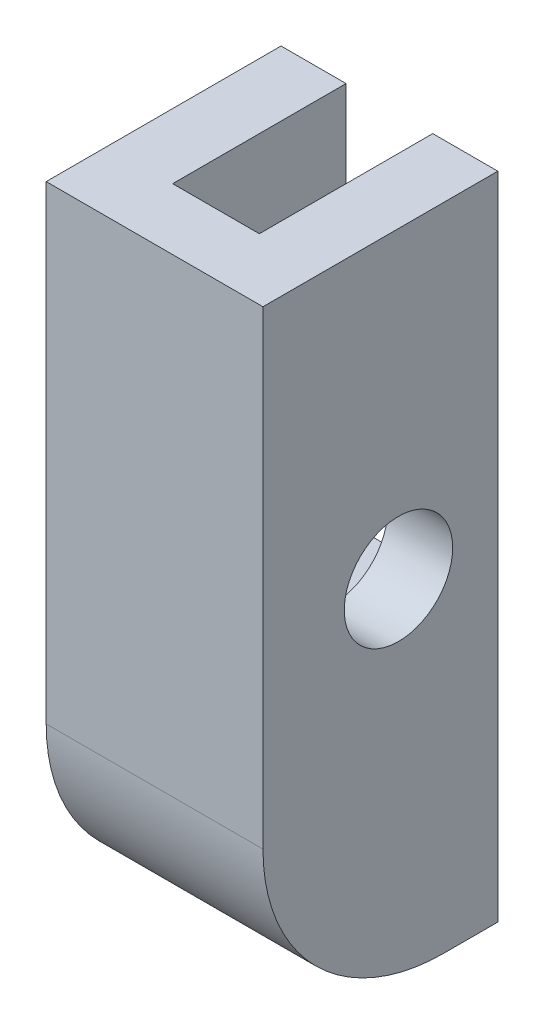
ISO-10303-21;
HEADER;
FILE_DESCRIPTION(('STEP AP214'),'2;1');
FILE_NAME('part.step','',(''),(''),'','','');
FILE_SCHEMA(('AUTOMOTIVE_DESIGN { 1 0 10303 214 1 1 1 1 }'));
ENDSEC;
DATA;
#1=APPLICATION_CONTEXT('core data for automotive mechanical design processes');
#2=APPLICATION_PROTOCOL_DEFINITION('international standard','automotive_design',2000,#1);
#3=PRODUCT_CONTEXT('',#1,'mechanical');
#4=PRODUCT('Part','Part','',(#3));
#5=PRODUCT_RELATED_PRODUCT_CATEGORY('part','',(#4));
#6=PRODUCT_DEFINITION_FORMATION('','',#4);
#7=PRODUCT_DEFINITION_CONTEXT('part definition',#1,'design');
#8=PRODUCT_DEFINITION('design','',#6,#7);
#9=PRODUCT_DEFINITION_SHAPE('','',#8);
#10=(LENGTH_UNIT() NAMED_UNIT(*) SI_UNIT(.MILLI.,.METRE.));
#11=(NAMED_UNIT(*) PLANE_ANGLE_UNIT() SI_UNIT($,.RADIAN.));
#12=(NAMED_UNIT(*) SI_UNIT($,.STERADIAN.) SOLID_ANGLE_UNIT());
#13=UNCERTAINTY_MEASURE_WITH_UNIT(LENGTH_MEASURE(1.E-05),#10,'distance_accuracy_value','');
#14=(GEOMETRIC_REPRESENTATION_CONTEXT(3) GLOBAL_UNCERTAINTY_ASSIGNED_CONTEXT((#13)) GLOBAL_UNIT_ASSIGNED_CONTEXT((#10,
#11,#12)) REPRESENTATION_CONTEXT('',''));
#15=CARTESIAN_POINT('',(0.,0.,0.));
#16=DIRECTION('',(0.,0.,1.));
#17=DIRECTION('',(1.,0.,0.));
#18=AXIS2_PLACEMENT_3D('',#15,#16,#17);
#19=CARTESIAN_POINT('',(7.62,-22.86,-8.255));
#20=DIRECTION('',(0.,0.,1.));
#21=DIRECTION('',(1.,0.,0.));
#22=AXIS2_PLACEMENT_3D('',#19,#20,#21);
#23=PLANE('',#22);
#24=DIRECTION('',(-1.,0.,0.));
#25=VECTOR('',#24,1.);
#26=CARTESIAN_POINT('',(3.048,-3.81,-8.255));
#27=LINE('',#26,#25);
#28=CARTESIAN_POINT('',(3.048,-3.81,-8.255));
#29=VERTEX_POINT('',#28);
#30=CARTESIAN_POINT('',(-3.048,-3.81,-8.255));
#31=VERTEX_POINT('',#30);
#32=EDGE_CURVE('E128',#29,#31,#27,.T.);
#33=ORIENTED_EDGE('',*,*,#32,.F.);
#34=DIRECTION('',(0.,-1.,0.));
#35=VECTOR('',#34,1.);
#36=CARTESIAN_POINT('',(3.048,22.86,-8.255));
#37=LINE('',#36,#35);
#38=CARTESIAN_POINT('',(3.048,22.86,-8.255));
#39=VERTEX_POINT('',#38);
#40=EDGE_CURVE('E113',#39,#29,#37,.T.);
#41=ORIENTED_EDGE('',*,*,#40,.F.);
#42=DIRECTION('',(-1.,0.,0.));
#43=VECTOR('',#42,1.);
#44=CARTESIAN_POINT('',(7.62,22.86,-8.255));
#45=LINE('',#44,#43);
#46=CARTESIAN_POINT('',(7.62,22.86,-8.255));
#47=VERTEX_POINT('',#46);
#48=EDGE_CURVE('E169',#47,#39,#45,.T.);
#49=ORIENTED_EDGE('',*,*,#48,.F.);
#50=DIRECTION('',(0.,1.,0.));
#51=VECTOR('',#50,1.);
#52=CARTESIAN_POINT('',(7.62,-22.86,-8.255));
#53=LINE('',#52,#51);
#54=CARTESIAN_POINT('',(7.62,-22.86,-8.255));
#55=VERTEX_POINT('',#54);
#56=EDGE_CURVE('E145',#55,#47,#53,.T.);
#57=ORIENTED_EDGE('',*,*,#56,.F.);
#58=DIRECTION('',(-1.,0.,0.));
#59=VECTOR('',#58,1.);
#60=CARTESIAN_POINT('',(7.62,-22.86,-8.255));
#61=LINE('',#60,#59);
#62=CARTESIAN_POINT('',(-7.62,-22.86,-8.255));
#63=VERTEX_POINT('',#62);
#64=EDGE_CURVE('E155',#55,#63,#61,.T.);
#65=ORIENTED_EDGE('',*,*,#64,.T.);
#66=DIRECTION('',(0.,1.,0.));
#67=VECTOR('',#66,1.);
#68=CARTESIAN_POINT('',(-7.62,-22.86,-8.255));
#69=LINE('',#68,#67);
#70=CARTESIAN_POINT('',(-7.62,22.86,-8.255));
#71=VERTEX_POINT('',#70);
#72=EDGE_CURVE('E140',#63,#71,#69,.T.);
#73=ORIENTED_EDGE('',*,*,#72,.T.);
#74=CARTESIAN_POINT('',(-3.048,22.86,-8.255));
#75=VERTEX_POINT('',#74);
#76=EDGE_CURVE('E168',#75,#71,#45,.T.);
#77=ORIENTED_EDGE('',*,*,#76,.F.);
#78=DIRECTION('',(0.,1.,0.));
#79=VECTOR('',#78,1.);
#80=CARTESIAN_POINT('',(-3.048,22.86,-8.255));
#81=LINE('',#80,#79);
#82=EDGE_CURVE('E126',#31,#75,#81,.T.);
#83=ORIENTED_EDGE('',*,*,#82,.F.);
#84=EDGE_LOOP('',(#33,#41,#49,#57,#65,#73,#77,#83));
#85=FACE_BOUND('',#84,.T.);
#86=ADVANCED_FACE('F34',(#85),#23,.F.);
#87=CARTESIAN_POINT('',(7.62,22.86,8.255));
#88=DIRECTION('',(0.,-1.,0.));
#89=DIRECTION('',(0.,0.,-1.));
#90=AXIS2_PLACEMENT_3D('',#87,#88,#89);
#91=PLANE('',#90);
#92=ORIENTED_EDGE('',*,*,#48,.T.);
#93=DIRECTION('',(0.,0.,-1.));
#94=VECTOR('',#93,1.);
#95=CARTESIAN_POINT('',(3.048,22.86,3.937));
#96=LINE('',#95,#94);
#97=CARTESIAN_POINT('',(3.048,22.86,3.937));
#98=VERTEX_POINT('',#97);
#99=EDGE_CURVE('E138',#98,#39,#96,.T.);
#100=ORIENTED_EDGE('',*,*,#99,.F.);
#101=DIRECTION('',(1.,0.,0.));
#102=VECTOR('',#101,1.);
#103=CARTESIAN_POINT('',(3.048,22.86,3.937));
#104=LINE('',#103,#102);
#105=CARTESIAN_POINT('',(-3.048,22.86,3.937));
#106=VERTEX_POINT('',#105);
#107=EDGE_CURVE('E118',#106,#98,#104,.T.);
#108=ORIENTED_EDGE('',*,*,#107,.F.);
#109=DIRECTION('',(0.,0.,-1.));
#110=VECTOR('',#109,1.);
#111=CARTESIAN_POINT('',(-3.048,22.86,3.937));
#112=LINE('',#111,#110);
#113=EDGE_CURVE('E141',#106,#75,#112,.T.);
#114=ORIENTED_EDGE('',*,*,#113,.T.);
#115=ORIENTED_EDGE('',*,*,#76,.T.);
#116=DIRECTION('',(0.,0.,1.));
#117=VECTOR('',#116,1.);
#118=CARTESIAN_POINT('',(-7.62,22.86,8.255));
#119=LINE('',#118,#117);
#120=CARTESIAN_POINT('',(-7.62,22.86,8.255));
#121=VERTEX_POINT('',#120);
#122=EDGE_CURVE('E158',#71,#121,#119,.T.);
#123=ORIENTED_EDGE('',*,*,#122,.T.);
#124=DIRECTION('',(-1.,0.,0.));
#125=VECTOR('',#124,1.);
#126=CARTESIAN_POINT('',(7.62,22.86,8.255));
#127=LINE('',#126,#125);
#128=CARTESIAN_POINT('',(7.62,22.86,8.255));
#129=VERTEX_POINT('',#128);
#130=EDGE_CURVE('E165',#129,#121,#127,.T.);
#131=ORIENTED_EDGE('',*,*,#130,.F.);
#132=DIRECTION('',(0.,0.,1.));
#133=VECTOR('',#132,1.);
#134=CARTESIAN_POINT('',(7.62,22.86,8.255));
#135=LINE('',#134,#133);
#136=EDGE_CURVE('E148',#47,#129,#135,.T.);
#137=ORIENTED_EDGE('',*,*,#136,.F.);
#138=EDGE_LOOP('',(#92,#100,#108,#114,#115,#123,#131,#137));
#139=FACE_BOUND('',#138,.T.);
#140=ADVANCED_FACE('F198',(#139),#91,.F.);
#141=CARTESIAN_POINT('',(7.62,-22.86,8.255));
#142=DIRECTION('',(0.,0.,-1.));
#143=DIRECTION('',(-1.,0.,0.));
#144=AXIS2_PLACEMENT_3D('',#141,#142,#143);
#145=PLANE('',#144);
#146=DIRECTION('',(0.,-1.,0.));
#147=VECTOR('',#146,1.);
#148=CARTESIAN_POINT('',(-7.62,-22.86,8.255));
#149=LINE('',#148,#147);
#150=CARTESIAN_POINT('',(-7.62,-10.16,8.255));
#151=VERTEX_POINT('',#150);
#152=EDGE_CURVE('E160',#121,#151,#149,.T.);
#153=ORIENTED_EDGE('',*,*,#152,.T.);
#154=DIRECTION('',(-1.,0.,0.));
#155=VECTOR('',#154,1.);
#156=CARTESIAN_POINT('',(7.62,-10.16,8.255));
#157=LINE('',#156,#155);
#158=CARTESIAN_POINT('',(7.62,-10.16,8.255));
#159=VERTEX_POINT('',#158);
#160=EDGE_CURVE('E43',#151,#159,#157,.F.);
#161=ORIENTED_EDGE('',*,*,#160,.T.);
#162=DIRECTION('',(0.,-1.,0.));
#163=VECTOR('',#162,1.);
#164=CARTESIAN_POINT('',(7.62,-22.86,8.255));
#165=LINE('',#164,#163);
#166=EDGE_CURVE('E151',#129,#159,#165,.T.);
#167=ORIENTED_EDGE('',*,*,#166,.F.);
#168=ORIENTED_EDGE('',*,*,#130,.T.);
#169=EDGE_LOOP('',(#153,#161,#167,#168));
#170=FACE_BOUND('',#169,.T.);
#171=ADVANCED_FACE('F185',(#170),#145,.F.);
#172=CARTESIAN_POINT('',(7.62,-22.86,8.255));
#173=DIRECTION('',(0.,1.,0.));
#174=DIRECTION('',(0.,0.,1.));
#175=AXIS2_PLACEMENT_3D('',#172,#173,#174);
#176=PLANE('',#175);
#177=DIRECTION('',(0.,0.,-1.));
#178=VECTOR('',#177,1.);
#179=CARTESIAN_POINT('',(7.62,-22.86,8.255));
#180=LINE('',#179,#178);
#181=CARTESIAN_POINT('',(7.62,-22.86,-4.445));
#182=VERTEX_POINT('',#181);
#183=EDGE_CURVE('E153',#182,#55,#180,.T.);
#184=ORIENTED_EDGE('',*,*,#183,.F.);
#185=DIRECTION('',(-1.,0.,0.));
#186=VECTOR('',#185,1.);
#187=CARTESIAN_POINT('',(7.62,-22.86,-4.445));
#188=LINE('',#187,#186);
#189=CARTESIAN_POINT('',(-7.62,-22.86,-4.445));
#190=VERTEX_POINT('',#189);
#191=EDGE_CURVE('E172',#182,#190,#188,.T.);
#192=ORIENTED_EDGE('',*,*,#191,.T.);
#193=DIRECTION('',(0.,0.,-1.));
#194=VECTOR('',#193,1.);
#195=CARTESIAN_POINT('',(-7.62,-22.86,8.255));
#196=LINE('',#195,#194);
#197=EDGE_CURVE('E149',#190,#63,#196,.T.);
#198=ORIENTED_EDGE('',*,*,#197,.T.);
#199=ORIENTED_EDGE('',*,*,#64,.F.);
#200=EDGE_LOOP('',(#184,#192,#198,#199));
#201=FACE_BOUND('',#200,.T.);
#202=ADVANCED_FACE('F193',(#201),#176,.F.);
#203=CARTESIAN_POINT('',(7.62,0.,0.));
#204=DIRECTION('',(-1.,0.,0.));
#205=DIRECTION('',(0.,0.,1.));
#206=AXIS2_PLACEMENT_3D('',#203,#204,#205);
#207=PLANE('',#206);
#208=CARTESIAN_POINT('',(7.62,1.524,-1.27));
#209=DIRECTION('',(1.,0.,0.));
#210=DIRECTION('',(0.,0.,-1.));
#211=AXIS2_PLACEMENT_3D('',#208,#209,#210);
#212=CIRCLE('',#211,3.81);
#213=CARTESIAN_POINT('',(7.62,1.524,-5.08));
#214=VERTEX_POINT('',#213);
#215=EDGE_CURVE('E234',#214,#214,#212,.T.);
#216=ORIENTED_EDGE('',*,*,#215,.F.);
#217=EDGE_LOOP('',(#216));
#218=FACE_BOUND('',#217,.T.);
#219=ORIENTED_EDGE('',*,*,#166,.T.);
#220=CARTESIAN_POINT('',(7.62,-10.16,-4.445));
#221=DIRECTION('',(-1.,0.,0.));
#222=DIRECTION('',(0.,0.,1.));
#223=AXIS2_PLACEMENT_3D('',#220,#221,#222);
#224=CIRCLE('',#223,12.7);
#225=EDGE_CURVE('E11',#159,#182,#224,.F.);
#226=ORIENTED_EDGE('',*,*,#225,.T.);
#227=ORIENTED_EDGE('',*,*,#183,.T.);
#228=ORIENTED_EDGE('',*,*,#56,.T.);
#229=ORIENTED_EDGE('',*,*,#136,.T.);
#230=EDGE_LOOP('',(#219,#226,#227,#228,#229));
#231=FACE_BOUND('',#230,.T.);
#232=ADVANCED_FACE('F190',(#218,#231),#207,.F.);
#233=CARTESIAN_POINT('',(-7.62,0.,0.));
#234=DIRECTION('',(-1.,0.,0.));
#235=DIRECTION('',(0.,0.,1.));
#236=AXIS2_PLACEMENT_3D('',#233,#234,#235);
#237=PLANE('',#236);
#238=CARTESIAN_POINT('',(-7.62,1.524,-1.27));
#239=DIRECTION('',(1.,0.,0.));
#240=DIRECTION('',(0.,0.,-1.));
#241=AXIS2_PLACEMENT_3D('',#238,#239,#240);
#242=CIRCLE('',#241,3.81);
#243=CARTESIAN_POINT('',(-7.62,1.524,-5.08));
#244=VERTEX_POINT('',#243);
#245=EDGE_CURVE('E236',#244,#244,#242,.T.);
#246=ORIENTED_EDGE('',*,*,#245,.T.);
#247=EDGE_LOOP('',(#246));
#248=FACE_BOUND('',#247,.T.);
#249=ORIENTED_EDGE('',*,*,#197,.F.);
#250=CARTESIAN_POINT('',(-7.62,-10.16,-4.445));
#251=DIRECTION('',(-1.,0.,0.));
#252=DIRECTION('',(0.,0.,1.));
#253=AXIS2_PLACEMENT_3D('',#250,#251,#252);
#254=CIRCLE('',#253,12.7);
#255=EDGE_CURVE('E175',#190,#151,#254,.T.);
#256=ORIENTED_EDGE('',*,*,#255,.T.);
#257=ORIENTED_EDGE('',*,*,#152,.F.);
#258=ORIENTED_EDGE('',*,*,#122,.F.);
#259=ORIENTED_EDGE('',*,*,#72,.F.);
#260=EDGE_LOOP('',(#249,#256,#257,#258,#259));
#261=FACE_BOUND('',#260,.T.);
#262=ADVANCED_FACE('F180',(#248,#261),#237,.T.);
#263=CARTESIAN_POINT('',(7.62,-10.16,-4.445));
#264=DIRECTION('',(-1.,0.,0.));
#265=DIRECTION('',(0.,0.,1.));
#266=AXIS2_PLACEMENT_3D('',#263,#264,#265);
#267=CYLINDRICAL_SURFACE('',#266,12.7);
#268=ORIENTED_EDGE('',*,*,#225,.F.);
#269=ORIENTED_EDGE('',*,*,#160,.F.);
#270=ORIENTED_EDGE('',*,*,#255,.F.);
#271=ORIENTED_EDGE('',*,*,#191,.F.);
#272=EDGE_LOOP('',(#268,#269,#270,#271));
#273=FACE_BOUND('',#272,.T.);
#274=ADVANCED_FACE('F36',(#273),#267,.T.);
#275=CARTESIAN_POINT('',(3.048,22.86,3.937));
#276=DIRECTION('',(1.,0.,0.));
#277=DIRECTION('',(0.,1.,0.));
#278=AXIS2_PLACEMENT_3D('',#275,#276,#277);
#279=PLANE('',#278);
#280=CARTESIAN_POINT('',(3.048,1.524,-1.27));
#281=DIRECTION('',(1.,0.,0.));
#282=DIRECTION('',(0.,1.,0.));
#283=AXIS2_PLACEMENT_3D('',#280,#281,#282);
#284=CIRCLE('',#283,3.81);
#285=CARTESIAN_POINT('',(3.048,1.524,-5.08));
#286=VERTEX_POINT('',#285);
#287=EDGE_CURVE('E131',#286,#286,#284,.T.);
#288=ORIENTED_EDGE('',*,*,#287,.T.);
#289=EDGE_LOOP('',(#288));
#290=FACE_BOUND('',#289,.T.);
#291=ORIENTED_EDGE('',*,*,#40,.T.);
#292=DIRECTION('',(0.,0.,-1.));
#293=VECTOR('',#292,1.);
#294=CARTESIAN_POINT('',(3.048,-3.81,3.937));
#295=LINE('',#294,#293);
#296=CARTESIAN_POINT('',(3.048,-3.81,3.937));
#297=VERTEX_POINT('',#296);
#298=EDGE_CURVE('E107',#297,#29,#295,.T.);
#299=ORIENTED_EDGE('',*,*,#298,.F.);
#300=DIRECTION('',(0.,-1.,0.));
#301=VECTOR('',#300,1.);
#302=CARTESIAN_POINT('',(3.048,22.86,3.937));
#303=LINE('',#302,#301);
#304=EDGE_CURVE('E111',#98,#297,#303,.T.);
#305=ORIENTED_EDGE('',*,*,#304,.F.);
#306=ORIENTED_EDGE('',*,*,#99,.T.);
#307=EDGE_LOOP('',(#291,#299,#305,#306));
#308=FACE_BOUND('',#307,.T.);
#309=ADVANCED_FACE('F109',(#290,#308),#279,.F.);
#310=CARTESIAN_POINT('',(-3.048,22.86,3.937));
#311=DIRECTION('',(-1.,0.,0.));
#312=DIRECTION('',(0.,-1.,0.));
#313=AXIS2_PLACEMENT_3D('',#310,#311,#312);
#314=PLANE('',#313);
#315=CARTESIAN_POINT('',(-3.048,1.524,-1.27));
#316=DIRECTION('',(-1.,0.,0.));
#317=DIRECTION('',(0.,-1.,0.));
#318=AXIS2_PLACEMENT_3D('',#315,#316,#317);
#319=CIRCLE('',#318,3.81);
#320=CARTESIAN_POINT('',(-3.048,1.524,-5.08));
#321=VERTEX_POINT('',#320);
#322=EDGE_CURVE('E38',#321,#321,#319,.T.);
#323=ORIENTED_EDGE('',*,*,#322,.T.);
#324=EDGE_LOOP('',(#323));
#325=FACE_BOUND('',#324,.T.);
#326=ORIENTED_EDGE('',*,*,#82,.T.);
#327=ORIENTED_EDGE('',*,*,#113,.F.);
#328=DIRECTION('',(0.,1.,0.));
#329=VECTOR('',#328,1.);
#330=CARTESIAN_POINT('',(-3.048,22.86,3.937));
#331=LINE('',#330,#329);
#332=CARTESIAN_POINT('',(-3.048,-3.81,3.937));
#333=VERTEX_POINT('',#332);
#334=EDGE_CURVE('E50',#333,#106,#331,.T.);
#335=ORIENTED_EDGE('',*,*,#334,.F.);
#336=DIRECTION('',(0.,0.,-1.));
#337=VECTOR('',#336,1.);
#338=CARTESIAN_POINT('',(-3.048,-3.81,3.937));
#339=LINE('',#338,#337);
#340=EDGE_CURVE('E117',#333,#31,#339,.T.);
#341=ORIENTED_EDGE('',*,*,#340,.T.);
#342=EDGE_LOOP('',(#326,#327,#335,#341));
#343=FACE_BOUND('',#342,.T.);
#344=ADVANCED_FACE('F202',(#325,#343),#314,.F.);
#345=CARTESIAN_POINT('',(3.048,-3.81,3.937));
#346=DIRECTION('',(0.,-1.,0.));
#347=DIRECTION('',(0.,0.,-1.));
#348=AXIS2_PLACEMENT_3D('',#345,#346,#347);
#349=PLANE('',#348);
#350=ORIENTED_EDGE('',*,*,#32,.T.);
#351=ORIENTED_EDGE('',*,*,#340,.F.);
#352=DIRECTION('',(-1.,0.,0.));
#353=VECTOR('',#352,1.);
#354=CARTESIAN_POINT('',(3.048,-3.81,3.937));
#355=LINE('',#354,#353);
#356=EDGE_CURVE('E120',#297,#333,#355,.T.);
#357=ORIENTED_EDGE('',*,*,#356,.F.);
#358=ORIENTED_EDGE('',*,*,#298,.T.);
#359=EDGE_LOOP('',(#350,#351,#357,#358));
#360=FACE_BOUND('',#359,.T.);
#361=ADVANCED_FACE('F121',(#360),#349,.F.);
#362=CARTESIAN_POINT('',(0.,0.,3.937));
#363=DIRECTION('',(0.,0.,-1.));
#364=DIRECTION('',(-1.,0.,0.));
#365=AXIS2_PLACEMENT_3D('',#362,#363,#364);
#366=PLANE('',#365);
#367=ORIENTED_EDGE('',*,*,#304,.T.);
#368=ORIENTED_EDGE('',*,*,#356,.T.);
#369=ORIENTED_EDGE('',*,*,#334,.T.);
#370=ORIENTED_EDGE('',*,*,#107,.T.);
#371=EDGE_LOOP('',(#367,#368,#369,#370));
#372=FACE_BOUND('',#371,.T.);
#373=ADVANCED_FACE('F123',(#372),#366,.T.);
#374=CARTESIAN_POINT('',(-7.62,1.524,-1.27));
#375=DIRECTION('',(1.,0.,0.));
#376=DIRECTION('',(0.,0.,-1.));
#377=AXIS2_PLACEMENT_3D('',#374,#375,#376);
#378=CYLINDRICAL_SURFACE('',#377,3.81);
#379=CARTESIAN_POINT('',(-7.62,1.524,-5.08));
#380=CARTESIAN_POINT('',(-7.572375,1.524,-5.08));
#381=CARTESIAN_POINT('',(-7.52475,1.524,-5.08));
#382=CARTESIAN_POINT('',(-7.4295,1.524,-5.08));
#383=CARTESIAN_POINT('',(-7.381875,1.524,-5.08));
#384=CARTESIAN_POINT('',(-7.286625,1.524,-5.08));
#385=CARTESIAN_POINT('',(-7.239,1.524,-5.08));
#386=CARTESIAN_POINT('',(-7.14375,1.524,-5.08));
#387=CARTESIAN_POINT('',(-7.096125,1.524,-5.08));
#388=CARTESIAN_POINT('',(-7.000875,1.524,-5.08));
#389=CARTESIAN_POINT('',(-6.95325,1.524,-5.08));
#390=CARTESIAN_POINT('',(-6.858,1.524,-5.08));
#391=CARTESIAN_POINT('',(-6.810375,1.524,-5.08));
#392=CARTESIAN_POINT('',(-6.715125,1.524,-5.08));
#393=CARTESIAN_POINT('',(-6.6675,1.524,-5.08));
#394=CARTESIAN_POINT('',(-6.57225,1.524,-5.08));
#395=CARTESIAN_POINT('',(-6.524625,1.524,-5.08));
#396=CARTESIAN_POINT('',(-6.429375,1.524,-5.08));
#397=CARTESIAN_POINT('',(-6.38175,1.524,-5.08));
#398=CARTESIAN_POINT('',(-6.2865,1.524,-5.08));
#399=CARTESIAN_POINT('',(-6.238875,1.524,-5.08));
#400=CARTESIAN_POINT('',(-6.143625,1.524,-5.08));
#401=CARTESIAN_POINT('',(-6.096,1.524,-5.08));
#402=CARTESIAN_POINT('',(-6.00075,1.524,-5.08));
#403=CARTESIAN_POINT('',(-5.953125,1.524,-5.08));
#404=CARTESIAN_POINT('',(-5.857875,1.524,-5.08));
#405=CARTESIAN_POINT('',(-5.81025,1.524,-5.08));
#406=CARTESIAN_POINT('',(-5.715,1.524,-5.08));
#407=CARTESIAN_POINT('',(-5.667375,1.524,-5.08));
#408=CARTESIAN_POINT('',(-5.572125,1.524,-5.08));
#409=CARTESIAN_POINT('',(-5.5245,1.524,-5.08));
#410=CARTESIAN_POINT('',(-5.42925,1.524,-5.08));
#411=CARTESIAN_POINT('',(-5.381625,1.524,-5.08));
#412=CARTESIAN_POINT('',(-5.286375,1.524,-5.08));
#413=CARTESIAN_POINT('',(-5.23875,1.524,-5.08));
#414=CARTESIAN_POINT('',(-5.1435,1.524,-5.08));
#415=CARTESIAN_POINT('',(-5.095875,1.524,-5.08));
#416=CARTESIAN_POINT('',(-5.000625,1.524,-5.08));
#417=CARTESIAN_POINT('',(-4.953,1.524,-5.08));
#418=CARTESIAN_POINT('',(-4.85775,1.524,-5.08));
#419=CARTESIAN_POINT('',(-4.810125,1.524,-5.08));
#420=CARTESIAN_POINT('',(-4.714875,1.524,-5.08));
#421=CARTESIAN_POINT('',(-4.66725,1.524,-5.08));
#422=CARTESIAN_POINT('',(-4.572,1.524,-5.08));
#423=CARTESIAN_POINT('',(-4.524375,1.524,-5.08));
#424=CARTESIAN_POINT('',(-4.429125,1.524,-5.08));
#425=CARTESIAN_POINT('',(-4.3815,1.524,-5.08));
#426=CARTESIAN_POINT('',(-4.28625,1.524,-5.08));
#427=CARTESIAN_POINT('',(-4.238625,1.524,-5.08));
#428=CARTESIAN_POINT('',(-4.143375,1.524,-5.08));
#429=CARTESIAN_POINT('',(-4.09575,1.524,-5.08));
#430=CARTESIAN_POINT('',(-4.0005,1.524,-5.08));
#431=CARTESIAN_POINT('',(-3.952875,1.524,-5.08));
#432=CARTESIAN_POINT('',(-3.857625,1.524,-5.08));
#433=CARTESIAN_POINT('',(-3.81,1.524,-5.08));
#434=CARTESIAN_POINT('',(-3.71475,1.524,-5.08));
#435=CARTESIAN_POINT('',(-3.667125,1.524,-5.08));
#436=CARTESIAN_POINT('',(-3.571875,1.524,-5.08));
#437=CARTESIAN_POINT('',(-3.52425,1.524,-5.08));
#438=CARTESIAN_POINT('',(-3.429,1.524,-5.08));
#439=CARTESIAN_POINT('',(-3.381375,1.524,-5.08));
#440=CARTESIAN_POINT('',(-3.286125,1.524,-5.08));
#441=CARTESIAN_POINT('',(-3.2385,1.524,-5.08));
#442=CARTESIAN_POINT('',(-3.14325,1.524,-5.08));
#443=CARTESIAN_POINT('',(-3.095625,1.524,-5.08));
#444=CARTESIAN_POINT('',(-3.048,1.524,-5.08));
#445=B_SPLINE_CURVE_WITH_KNOTS('',3,(#379,#380,#381,#382,#383,#384,#385,#386,#387,#388,#389,
#390,#391,#392,#393,#394,#395,#396,#397,#398,#399,#400,#401,#402,#403,#404,#405,#406,#407,#408,
#409,#410,#411,#412,#413,#414,#415,#416,#417,#418,#419,#420,#421,#422,#423,#424,#425,#426,#427,
#428,#429,#430,#431,#432,#433,#434,#435,#436,#437,#438,#439,#440,#441,#442,#443,#444),
.UNSPECIFIED.,.F.,.F.,(4,2,2,2,2,2,2,2,2,2,2,2,2,2,2,2,2,2,2,2,2,2,2,2,2,2,2,2,2,2,2,2,4),(0.,
0.142875,0.28575,0.428624999999999,0.571499999999999,0.714375,0.85725,1.000125,1.143,1.285875,
1.42875,1.571625,1.7145,1.857375,2.00025,2.143125,2.286,2.428875,2.57175,2.714625,2.8575,
3.000375,3.14325,3.286125,3.429,3.571875,3.71475,3.857625,4.0005,4.143375,4.28625,4.429125,
4.572),.UNSPECIFIED.);
#446=EDGE_CURVE('BSEAM246',#244,#321,#445,.T.);
#447=ORIENTED_EDGE('',*,*,#245,.F.);
#448=ORIENTED_EDGE('',*,*,#322,.F.);
#449=ORIENTED_EDGE('',*,*,#446,.T.);
#450=ORIENTED_EDGE('',*,*,#446,.F.);
#451=EDGE_LOOP('',(#447,#449,#448,#450));
#452=FACE_BOUND('',#451,.T.);
#453=ADVANCED_FACE('F246',(#452),#378,.F.);
#454=CARTESIAN_POINT('',(7.62,1.524,-5.08));
#455=CARTESIAN_POINT('',(7.572375,1.524,-5.08));
#456=CARTESIAN_POINT('',(7.52475,1.524,-5.08));
#457=CARTESIAN_POINT('',(7.4295,1.524,-5.08));
#458=CARTESIAN_POINT('',(7.381875,1.524,-5.08));
#459=CARTESIAN_POINT('',(7.286625,1.524,-5.08));
#460=CARTESIAN_POINT('',(7.239,1.524,-5.08));
#461=CARTESIAN_POINT('',(7.14375,1.524,-5.08));
#462=CARTESIAN_POINT('',(7.096125,1.524,-5.08));
#463=CARTESIAN_POINT('',(7.000875,1.524,-5.08));
#464=CARTESIAN_POINT('',(6.95325,1.524,-5.08));
#465=CARTESIAN_POINT('',(6.858,1.524,-5.08));
#466=CARTESIAN_POINT('',(6.810375,1.524,-5.08));
#467=CARTESIAN_POINT('',(6.715125,1.524,-5.08));
#468=CARTESIAN_POINT('',(6.6675,1.524,-5.08));
#469=CARTESIAN_POINT('',(6.57225,1.524,-5.08));
#470=CARTESIAN_POINT('',(6.524625,1.524,-5.08));
#471=CARTESIAN_POINT('',(6.429375,1.524,-5.08));
#472=CARTESIAN_POINT('',(6.38175,1.524,-5.08));
#473=CARTESIAN_POINT('',(6.2865,1.524,-5.08));
#474=CARTESIAN_POINT('',(6.238875,1.524,-5.08));
#475=CARTESIAN_POINT('',(6.143625,1.524,-5.08));
#476=CARTESIAN_POINT('',(6.096,1.524,-5.08));
#477=CARTESIAN_POINT('',(6.00075,1.524,-5.08));
#478=CARTESIAN_POINT('',(5.953125,1.524,-5.08));
#479=CARTESIAN_POINT('',(5.857875,1.524,-5.08));
#480=CARTESIAN_POINT('',(5.81025,1.524,-5.08));
#481=CARTESIAN_POINT('',(5.715,1.524,-5.08));
#482=CARTESIAN_POINT('',(5.667375,1.524,-5.08));
#483=CARTESIAN_POINT('',(5.572125,1.524,-5.08));
#484=CARTESIAN_POINT('',(5.5245,1.524,-5.08));
#485=CARTESIAN_POINT('',(5.42925,1.524,-5.08));
#486=CARTESIAN_POINT('',(5.381625,1.524,-5.08));
#487=CARTESIAN_POINT('',(5.286375,1.524,-5.08));
#488=CARTESIAN_POINT('',(5.23875,1.524,-5.08));
#489=CARTESIAN_POINT('',(5.1435,1.524,-5.08));
#490=CARTESIAN_POINT('',(5.095875,1.524,-5.08));
#491=CARTESIAN_POINT('',(5.000625,1.524,-5.08));
#492=CARTESIAN_POINT('',(4.953,1.524,-5.08));
#493=CARTESIAN_POINT('',(4.85775,1.524,-5.08));
#494=CARTESIAN_POINT('',(4.810125,1.524,-5.08));
#495=CARTESIAN_POINT('',(4.714875,1.524,-5.08));
#496=CARTESIAN_POINT('',(4.66725,1.524,-5.08));
#497=CARTESIAN_POINT('',(4.572,1.524,-5.08));
#498=CARTESIAN_POINT('',(4.524375,1.524,-5.08));
#499=CARTESIAN_POINT('',(4.429125,1.524,-5.08));
#500=CARTESIAN_POINT('',(4.3815,1.524,-5.08));
#501=CARTESIAN_POINT('',(4.28625,1.524,-5.08));
#502=CARTESIAN_POINT('',(4.238625,1.524,-5.08));
#503=CARTESIAN_POINT('',(4.143375,1.524,-5.08));
#504=CARTESIAN_POINT('',(4.09575,1.524,-5.08));
#505=CARTESIAN_POINT('',(4.0005,1.524,-5.08));
#506=CARTESIAN_POINT('',(3.952875,1.524,-5.08));
#507=CARTESIAN_POINT('',(3.857625,1.524,-5.08));
#508=CARTESIAN_POINT('',(3.81,1.524,-5.08));
#509=CARTESIAN_POINT('',(3.71475,1.524,-5.08));
#510=CARTESIAN_POINT('',(3.667125,1.524,-5.08));
#511=CARTESIAN_POINT('',(3.571875,1.524,-5.08));
#512=CARTESIAN_POINT('',(3.52425,1.524,-5.08));
#513=CARTESIAN_POINT('',(3.429,1.524,-5.08));
#514=CARTESIAN_POINT('',(3.381375,1.524,-5.08));
#515=CARTESIAN_POINT('',(3.286125,1.524,-5.08));
#516=CARTESIAN_POINT('',(3.2385,1.524,-5.08));
#517=CARTESIAN_POINT('',(3.14325,1.524,-5.08));
#518=CARTESIAN_POINT('',(3.095625,1.524,-5.08));
#519=CARTESIAN_POINT('',(3.048,1.524,-5.08));
#520=B_SPLINE_CURVE_WITH_KNOTS('',3,(#454,#455,#456,#457,#458,#459,#460,#461,#462,#463,#464,
#465,#466,#467,#468,#469,#470,#471,#472,#473,#474,#475,#476,#477,#478,#479,#480,#481,#482,#483,
#484,#485,#486,#487,#488,#489,#490,#491,#492,#493,#494,#495,#496,#497,#498,#499,#500,#501,#502,
#503,#504,#505,#506,#507,#508,#509,#510,#511,#512,#513,#514,#515,#516,#517,#518,#519),
.UNSPECIFIED.,.F.,.F.,(4,2,2,2,2,2,2,2,2,2,2,2,2,2,2,2,2,2,2,2,2,2,2,2,2,2,2,2,2,2,2,2,4),(0.,
0.142875000000001,0.28575,0.428625,0.571500000000001,0.714375,0.85725,1.000125,1.143,1.285875,
1.42875,1.571625,1.7145,1.857375,2.00025,2.143125,2.286,2.428875,2.57175,2.714625,2.8575,
3.000375,3.14325,3.286125,3.429,3.571875,3.71475,3.857625,4.0005,4.143375,4.28625,4.429125,
4.572),.UNSPECIFIED.);
#521=EDGE_CURVE('BSEAM244',#214,#286,#520,.T.);
#522=ORIENTED_EDGE('',*,*,#215,.T.);
#523=ORIENTED_EDGE('',*,*,#287,.F.);
#524=ORIENTED_EDGE('',*,*,#521,.T.);
#525=ORIENTED_EDGE('',*,*,#521,.F.);
#526=EDGE_LOOP('',(#522,#524,#523,#525));
#527=FACE_BOUND('',#526,.T.);
#528=ADVANCED_FACE('F244',(#527),#378,.F.);
#529=CLOSED_SHELL('',(#86,#140,#171,#202,#232,#262,#274,#309,#344,#361,#373,#453,#528));
#530=MANIFOLD_SOLID_BREP('B2',#529);
#531=ADVANCED_BREP_SHAPE_REPRESENTATION('',(#18,#530),#14);
#532=SHAPE_DEFINITION_REPRESENTATION(#9,#531);
ENDSEC;
END-ISO-10303-21;
